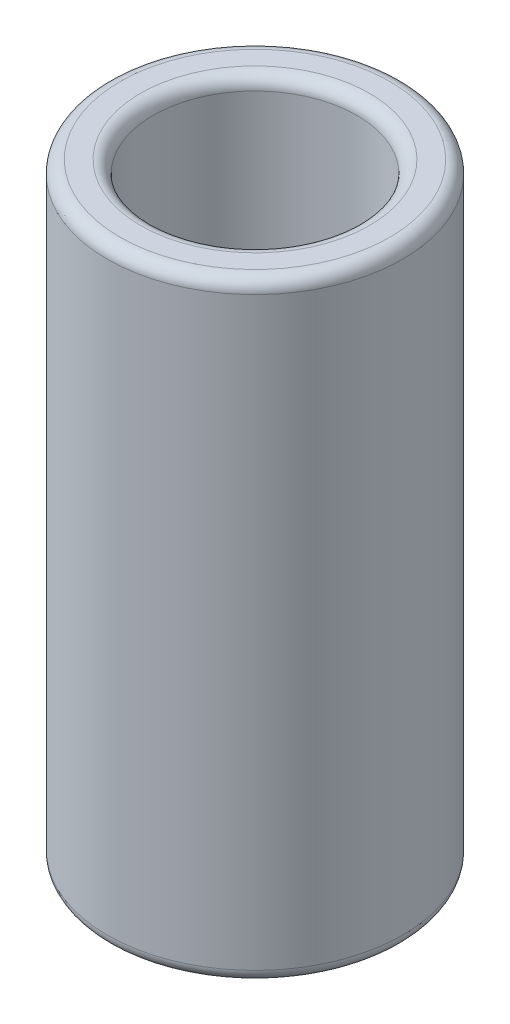
ISO-10303-21;
HEADER;
FILE_DESCRIPTION(('STEP AP214'),'2;1');
FILE_NAME('part.step','',(''),(''),'','','');
FILE_SCHEMA(('AUTOMOTIVE_DESIGN { 1 0 10303 214 1 1 1 1 }'));
ENDSEC;
DATA;
#1=APPLICATION_CONTEXT('core data for automotive mechanical design processes');
#2=APPLICATION_PROTOCOL_DEFINITION('international standard','automotive_design',2000,#1);
#3=PRODUCT_CONTEXT('',#1,'mechanical');
#4=PRODUCT('Part','Part','',(#3));
#5=PRODUCT_RELATED_PRODUCT_CATEGORY('part','',(#4));
#6=PRODUCT_DEFINITION_FORMATION('','',#4);
#7=PRODUCT_DEFINITION_CONTEXT('part definition',#1,'design');
#8=PRODUCT_DEFINITION('design','',#6,#7);
#9=PRODUCT_DEFINITION_SHAPE('','',#8);
#10=(LENGTH_UNIT() NAMED_UNIT(*) SI_UNIT(.MILLI.,.METRE.));
#11=(NAMED_UNIT(*) PLANE_ANGLE_UNIT() SI_UNIT($,.RADIAN.));
#12=(NAMED_UNIT(*) SI_UNIT($,.STERADIAN.) SOLID_ANGLE_UNIT());
#13=UNCERTAINTY_MEASURE_WITH_UNIT(LENGTH_MEASURE(1.E-05),#10,'distance_accuracy_value','');
#14=(GEOMETRIC_REPRESENTATION_CONTEXT(3) GLOBAL_UNCERTAINTY_ASSIGNED_CONTEXT((#13)) GLOBAL_UNIT_ASSIGNED_CONTEXT((#10,
#11,#12)) REPRESENTATION_CONTEXT('',''));
#15=CARTESIAN_POINT('',(0.,0.,0.));
#16=DIRECTION('',(0.,0.,1.));
#17=DIRECTION('',(1.,0.,0.));
#18=AXIS2_PLACEMENT_3D('',#15,#16,#17);
#19=CARTESIAN_POINT('',(0.,24.,0.));
#20=DIRECTION('',(0.,1.,0.));
#21=DIRECTION('',(0.,0.,1.));
#22=AXIS2_PLACEMENT_3D('',#19,#20,#21);
#23=PLANE('',#22);
#24=CARTESIAN_POINT('',(0.,24.,0.));
#25=DIRECTION('',(0.,1.,0.));
#26=DIRECTION('',(0.,0.,1.));
#27=AXIS2_PLACEMENT_3D('',#24,#25,#26);
#28=CIRCLE('',#27,4.5);
#29=CARTESIAN_POINT('',(0.,24.,4.5));
#30=VERTEX_POINT('',#29);
#31=EDGE_CURVE('E10',#30,#30,#28,.F.);
#32=ORIENTED_EDGE('',*,*,#31,.T.);
#33=EDGE_LOOP('',(#32));
#34=FACE_BOUND('',#33,.T.);
#35=CARTESIAN_POINT('',(0.,24.,0.));
#36=DIRECTION('',(0.,1.,0.));
#37=DIRECTION('',(0.,0.,1.));
#38=AXIS2_PLACEMENT_3D('',#35,#36,#37);
#39=CIRCLE('',#38,5.3);
#40=CARTESIAN_POINT('',(0.,24.,5.3));
#41=VERTEX_POINT('',#40);
#42=EDGE_CURVE('E55',#41,#41,#39,.T.);
#43=ORIENTED_EDGE('',*,*,#42,.T.);
#44=EDGE_LOOP('',(#43));
#45=FACE_BOUND('',#44,.T.);
#46=ADVANCED_FACE('F35',(#34,#45),#23,.T.);
#47=CARTESIAN_POINT('',(0.,0.,0.));
#48=DIRECTION('',(0.,1.,0.));
#49=DIRECTION('',(0.,0.,1.));
#50=AXIS2_PLACEMENT_3D('',#47,#48,#49);
#51=PLANE('',#50);
#52=CARTESIAN_POINT('',(0.,0.,0.));
#53=DIRECTION('',(0.,1.,0.));
#54=DIRECTION('',(0.,0.,1.));
#55=AXIS2_PLACEMENT_3D('',#52,#53,#54);
#56=CIRCLE('',#55,4.5);
#57=CARTESIAN_POINT('',(0.,0.,4.5));
#58=VERTEX_POINT('',#57);
#59=EDGE_CURVE('E50',#58,#58,#56,.T.);
#60=ORIENTED_EDGE('',*,*,#59,.T.);
#61=EDGE_LOOP('',(#60));
#62=FACE_BOUND('',#61,.T.);
#63=CARTESIAN_POINT('',(0.,0.,0.));
#64=DIRECTION('',(0.,1.,0.));
#65=DIRECTION('',(0.,0.,1.));
#66=AXIS2_PLACEMENT_3D('',#63,#64,#65);
#67=CIRCLE('',#66,5.3);
#68=CARTESIAN_POINT('',(0.,0.,5.3));
#69=VERTEX_POINT('',#68);
#70=EDGE_CURVE('E58',#69,#69,#67,.F.);
#71=ORIENTED_EDGE('',*,*,#70,.T.);
#72=EDGE_LOOP('',(#71));
#73=FACE_BOUND('',#72,.T.);
#74=ADVANCED_FACE('F79',(#62,#73),#51,.F.);
#75=CARTESIAN_POINT('',(0.,24.,0.));
#76=DIRECTION('',(0.,-1.,0.));
#77=DIRECTION('',(0.,0.,-1.));
#78=AXIS2_PLACEMENT_3D('',#75,#76,#77);
#79=CYLINDRICAL_SURFACE('',#78,5.8);
#80=CARTESIAN_POINT('',(0.,0.5,0.));
#81=DIRECTION('',(0.,1.,0.));
#82=DIRECTION('',(0.,0.,1.));
#83=AXIS2_PLACEMENT_3D('',#80,#81,#82);
#84=CIRCLE('',#83,5.8);
#85=CARTESIAN_POINT('',(0.,0.5,5.8));
#86=VERTEX_POINT('',#85);
#87=EDGE_CURVE('E61',#86,#86,#84,.T.);
#88=ORIENTED_EDGE('',*,*,#87,.T.);
#89=EDGE_LOOP('',(#88));
#90=FACE_BOUND('',#89,.T.);
#91=CARTESIAN_POINT('',(0.,23.5,0.));
#92=DIRECTION('',(0.,1.,0.));
#93=DIRECTION('',(0.,0.,1.));
#94=AXIS2_PLACEMENT_3D('',#91,#92,#93);
#95=CIRCLE('',#94,5.8);
#96=CARTESIAN_POINT('',(0.,23.5,5.8));
#97=VERTEX_POINT('',#96);
#98=EDGE_CURVE('E64',#97,#97,#95,.F.);
#99=ORIENTED_EDGE('',*,*,#98,.T.);
#100=EDGE_LOOP('',(#99));
#101=FACE_BOUND('',#100,.T.);
#102=ADVANCED_FACE('F68',(#90,#101),#79,.T.);
#103=CARTESIAN_POINT('',(0.,24.,0.));
#104=DIRECTION('',(0.,-1.,0.));
#105=DIRECTION('',(0.,0.,-1.));
#106=AXIS2_PLACEMENT_3D('',#103,#104,#105);
#107=CYLINDRICAL_SURFACE('',#106,4.);
#108=CARTESIAN_POINT('',(0.,0.5,0.));
#109=DIRECTION('',(0.,1.,0.));
#110=DIRECTION('',(0.,0.,1.));
#111=AXIS2_PLACEMENT_3D('',#108,#109,#110);
#112=CIRCLE('',#111,4.);
#113=CARTESIAN_POINT('',(0.,0.5,4.));
#114=VERTEX_POINT('',#113);
#115=EDGE_CURVE('E42',#114,#114,#112,.F.);
#116=ORIENTED_EDGE('',*,*,#115,.T.);
#117=EDGE_LOOP('',(#116));
#118=FACE_BOUND('',#117,.T.);
#119=CARTESIAN_POINT('',(0.,23.5,0.));
#120=DIRECTION('',(0.,1.,0.));
#121=DIRECTION('',(0.,0.,1.));
#122=AXIS2_PLACEMENT_3D('',#119,#120,#121);
#123=CIRCLE('',#122,4.);
#124=CARTESIAN_POINT('',(0.,23.5,4.));
#125=VERTEX_POINT('',#124);
#126=EDGE_CURVE('E46',#125,#125,#123,.T.);
#127=ORIENTED_EDGE('',*,*,#126,.T.);
#128=EDGE_LOOP('',(#127));
#129=FACE_BOUND('',#128,.T.);
#130=ADVANCED_FACE('F87',(#118,#129),#107,.F.);
#131=CARTESIAN_POINT('',(0.,0.5,0.));
#132=DIRECTION('',(0.,1.,0.));
#133=DIRECTION('',(0.,0.,1.));
#134=AXIS2_PLACEMENT_3D('',#131,#132,#133);
#135=TOROIDAL_SURFACE('',#134,5.3,0.5);
#136=ORIENTED_EDGE('',*,*,#70,.F.);
#137=EDGE_LOOP('',(#136));
#138=FACE_BOUND('',#137,.T.);
#139=ORIENTED_EDGE('',*,*,#87,.F.);
#140=EDGE_LOOP('',(#139));
#141=FACE_BOUND('',#140,.T.);
#142=ADVANCED_FACE('F74',(#138,#141),#135,.T.);
#143=CARTESIAN_POINT('',(0.,23.5,0.));
#144=DIRECTION('',(0.,1.,0.));
#145=DIRECTION('',(0.,0.,1.));
#146=AXIS2_PLACEMENT_3D('',#143,#144,#145);
#147=TOROIDAL_SURFACE('',#146,5.3,0.5);
#148=ORIENTED_EDGE('',*,*,#98,.F.);
#149=EDGE_LOOP('',(#148));
#150=FACE_BOUND('',#149,.T.);
#151=ORIENTED_EDGE('',*,*,#42,.F.);
#152=EDGE_LOOP('',(#151));
#153=FACE_BOUND('',#152,.T.);
#154=ADVANCED_FACE('F70',(#150,#153),#147,.T.);
#155=CARTESIAN_POINT('',(0.,0.5,0.));
#156=DIRECTION('',(0.,1.,0.));
#157=DIRECTION('',(0.,0.,1.));
#158=AXIS2_PLACEMENT_3D('',#155,#156,#157);
#159=TOROIDAL_SURFACE('',#158,4.5,0.5);
#160=ORIENTED_EDGE('',*,*,#115,.F.);
#161=EDGE_LOOP('',(#160));
#162=FACE_BOUND('',#161,.T.);
#163=ORIENTED_EDGE('',*,*,#59,.F.);
#164=EDGE_LOOP('',(#163));
#165=FACE_BOUND('',#164,.T.);
#166=ADVANCED_FACE('F73',(#162,#165),#159,.T.);
#167=CARTESIAN_POINT('',(0.,23.5,0.));
#168=DIRECTION('',(0.,1.,0.));
#169=DIRECTION('',(0.,0.,1.));
#170=AXIS2_PLACEMENT_3D('',#167,#168,#169);
#171=TOROIDAL_SURFACE('',#170,4.5,0.5);
#172=ORIENTED_EDGE('',*,*,#31,.F.);
#173=EDGE_LOOP('',(#172));
#174=FACE_BOUND('',#173,.T.);
#175=ORIENTED_EDGE('',*,*,#126,.F.);
#176=EDGE_LOOP('',(#175));
#177=FACE_BOUND('',#176,.T.);
#178=ADVANCED_FACE('F37',(#174,#177),#171,.T.);
#179=CLOSED_SHELL('',(#46,#74,#102,#130,#142,#154,#166,#178));
#180=MANIFOLD_SOLID_BREP('B2',#179);
#181=ADVANCED_BREP_SHAPE_REPRESENTATION('',(#18,#180),#14);
#182=SHAPE_DEFINITION_REPRESENTATION(#9,#181);
ENDSEC;
END-ISO-10303-21;
